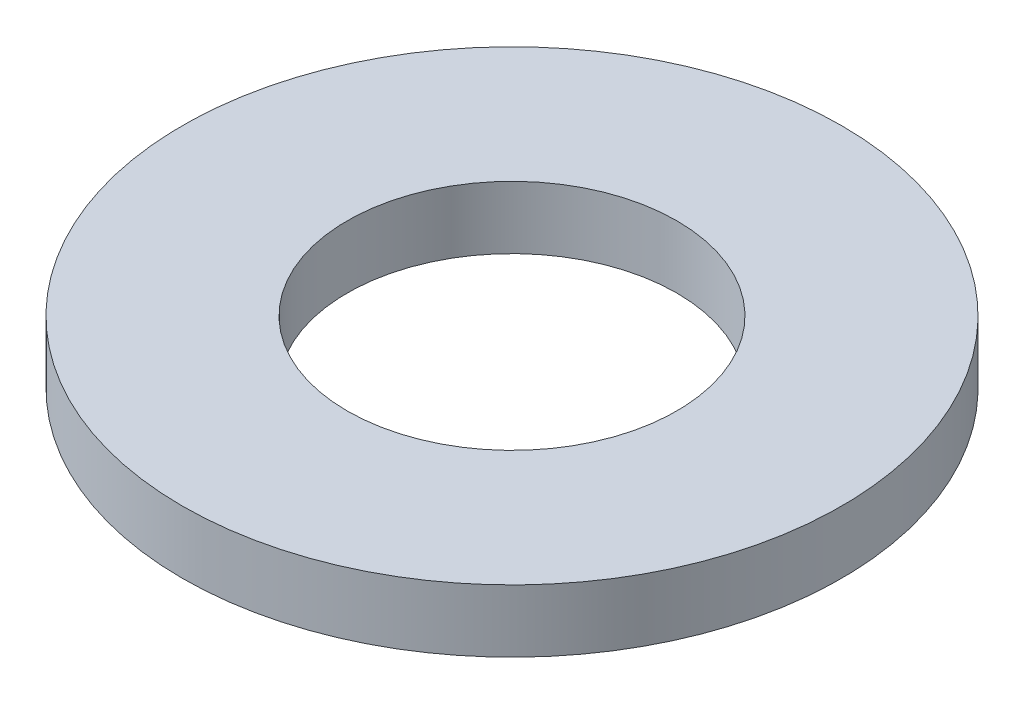
ISO-10303-21;
HEADER;
FILE_DESCRIPTION(('STEP AP214'),'2;1');
FILE_NAME('part.step','',(''),(''),'','','');
FILE_SCHEMA(('AUTOMOTIVE_DESIGN { 1 0 10303 214 1 1 1 1 }'));
ENDSEC;
DATA;
#1=APPLICATION_CONTEXT('core data for automotive mechanical design processes');
#2=APPLICATION_PROTOCOL_DEFINITION('international standard','automotive_design',2000,#1);
#3=PRODUCT_CONTEXT('',#1,'mechanical');
#4=PRODUCT('Part','Part','',(#3));
#5=PRODUCT_RELATED_PRODUCT_CATEGORY('part','',(#4));
#6=PRODUCT_DEFINITION_FORMATION('','',#4);
#7=PRODUCT_DEFINITION_CONTEXT('part definition',#1,'design');
#8=PRODUCT_DEFINITION('design','',#6,#7);
#9=PRODUCT_DEFINITION_SHAPE('','',#8);
#10=(LENGTH_UNIT() NAMED_UNIT(*) SI_UNIT(.MILLI.,.METRE.));
#11=(NAMED_UNIT(*) PLANE_ANGLE_UNIT() SI_UNIT($,.RADIAN.));
#12=(NAMED_UNIT(*) SI_UNIT($,.STERADIAN.) SOLID_ANGLE_UNIT());
#13=UNCERTAINTY_MEASURE_WITH_UNIT(LENGTH_MEASURE(1.E-05),#10,'distance_accuracy_value','');
#14=(GEOMETRIC_REPRESENTATION_CONTEXT(3) GLOBAL_UNCERTAINTY_ASSIGNED_CONTEXT((#13)) GLOBAL_UNIT_ASSIGNED_CONTEXT((#10,
#11,#12)) REPRESENTATION_CONTEXT('',''));
#15=CARTESIAN_POINT('',(0.,0.,0.));
#16=DIRECTION('',(0.,0.,1.));
#17=DIRECTION('',(1.,0.,0.));
#18=AXIS2_PLACEMENT_3D('',#15,#16,#17);
#19=CARTESIAN_POINT('',(0.,1.14,0.));
#20=DIRECTION('',(0.,1.,0.));
#21=DIRECTION('',(0.,0.,1.));
#22=AXIS2_PLACEMENT_3D('',#19,#20,#21);
#23=PLANE('',#22);
#24=CARTESIAN_POINT('',(0.,1.14,0.));
#25=DIRECTION('',(0.,1.,0.));
#26=DIRECTION('',(0.,0.,1.));
#27=AXIS2_PLACEMENT_3D('',#24,#25,#26);
#28=CIRCLE('',#27,6.);
#29=CARTESIAN_POINT('',(0.,1.14,6.));
#30=VERTEX_POINT('',#29);
#31=EDGE_CURVE('E10',#30,#30,#28,.T.);
#32=ORIENTED_EDGE('',*,*,#31,.T.);
#33=EDGE_LOOP('',(#32));
#34=FACE_BOUND('',#33,.T.);
#35=CARTESIAN_POINT('',(0.,1.14,0.));
#36=DIRECTION('',(0.,1.,0.));
#37=DIRECTION('',(0.,0.,1.));
#38=AXIS2_PLACEMENT_3D('',#35,#36,#37);
#39=CIRCLE('',#38,3.);
#40=CARTESIAN_POINT('',(0.,1.14,3.));
#41=VERTEX_POINT('',#40);
#42=EDGE_CURVE('E49',#41,#41,#39,.T.);
#43=ORIENTED_EDGE('',*,*,#42,.F.);
#44=EDGE_LOOP('',(#43));
#45=FACE_BOUND('',#44,.T.);
#46=ADVANCED_FACE('F36',(#34,#45),#23,.T.);
#47=CARTESIAN_POINT('',(0.,0.,0.));
#48=DIRECTION('',(0.,1.,0.));
#49=DIRECTION('',(0.,0.,1.));
#50=AXIS2_PLACEMENT_3D('',#47,#48,#49);
#51=PLANE('',#50);
#52=CARTESIAN_POINT('',(0.,0.,0.));
#53=DIRECTION('',(0.,1.,0.));
#54=DIRECTION('',(0.,0.,1.));
#55=AXIS2_PLACEMENT_3D('',#52,#53,#54);
#56=CIRCLE('',#55,6.);
#57=CARTESIAN_POINT('',(0.,0.,6.));
#58=VERTEX_POINT('',#57);
#59=EDGE_CURVE('E40',#58,#58,#56,.T.);
#60=ORIENTED_EDGE('',*,*,#59,.F.);
#61=EDGE_LOOP('',(#60));
#62=FACE_BOUND('',#61,.T.);
#63=CARTESIAN_POINT('',(0.,0.,0.));
#64=DIRECTION('',(0.,1.,0.));
#65=DIRECTION('',(0.,0.,1.));
#66=AXIS2_PLACEMENT_3D('',#63,#64,#65);
#67=CIRCLE('',#66,3.);
#68=CARTESIAN_POINT('',(0.,0.,3.));
#69=VERTEX_POINT('',#68);
#70=EDGE_CURVE('E51',#69,#69,#67,.T.);
#71=ORIENTED_EDGE('',*,*,#70,.T.);
#72=EDGE_LOOP('',(#71));
#73=FACE_BOUND('',#72,.T.);
#74=ADVANCED_FACE('F63',(#62,#73),#51,.F.);
#75=CARTESIAN_POINT('',(0.,1.14,0.));
#76=DIRECTION('',(0.,-1.,0.));
#77=DIRECTION('',(0.,0.,-1.));
#78=AXIS2_PLACEMENT_3D('',#75,#76,#77);
#79=CYLINDRICAL_SURFACE('',#78,6.);
#80=ORIENTED_EDGE('',*,*,#31,.F.);
#81=EDGE_LOOP('',(#80));
#82=FACE_BOUND('',#81,.T.);
#83=ORIENTED_EDGE('',*,*,#59,.T.);
#84=EDGE_LOOP('',(#83));
#85=FACE_BOUND('',#84,.T.);
#86=ADVANCED_FACE('F38',(#82,#85),#79,.T.);
#87=CARTESIAN_POINT('',(0.,1.14,0.));
#88=DIRECTION('',(0.,-1.,0.));
#89=DIRECTION('',(0.,0.,-1.));
#90=AXIS2_PLACEMENT_3D('',#87,#88,#89);
#91=CYLINDRICAL_SURFACE('',#90,3.);
#92=ORIENTED_EDGE('',*,*,#42,.T.);
#93=EDGE_LOOP('',(#92));
#94=FACE_BOUND('',#93,.T.);
#95=ORIENTED_EDGE('',*,*,#70,.F.);
#96=EDGE_LOOP('',(#95));
#97=FACE_BOUND('',#96,.T.);
#98=ADVANCED_FACE('F59',(#94,#97),#91,.F.);
#99=CLOSED_SHELL('',(#46,#74,#86,#98));
#100=MANIFOLD_SOLID_BREP('B2',#99);
#101=ADVANCED_BREP_SHAPE_REPRESENTATION('',(#18,#100),#14);
#102=SHAPE_DEFINITION_REPRESENTATION(#9,#101);
ENDSEC;
END-ISO-10303-21;
